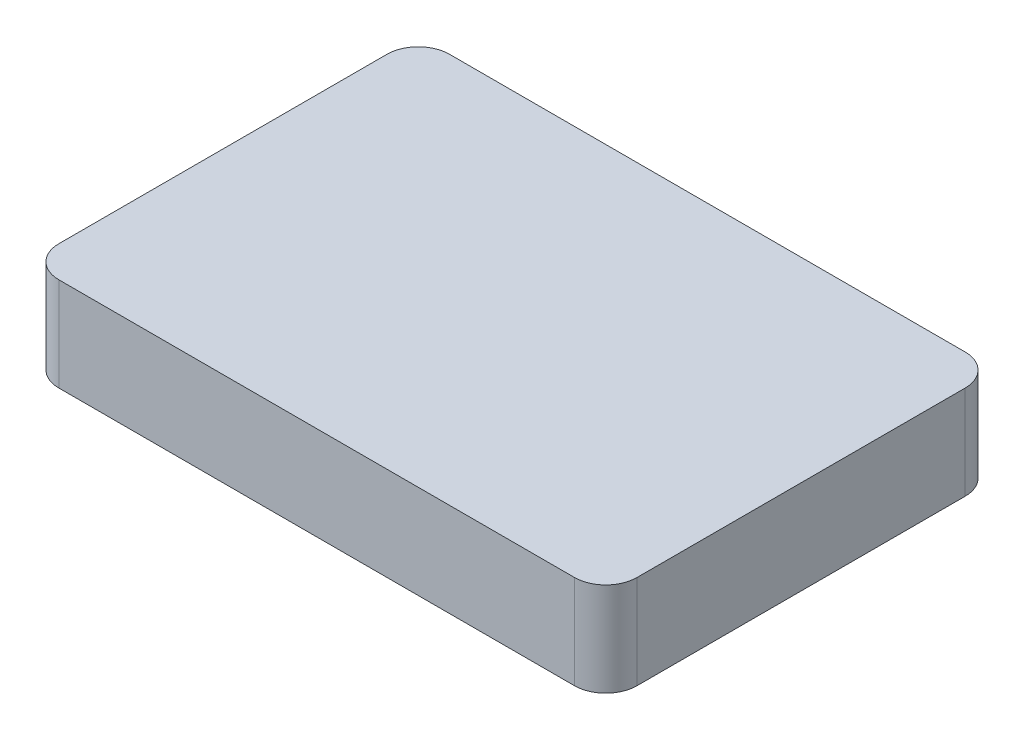
ISO-10303-21;
HEADER;
FILE_DESCRIPTION(('STEP AP214'),'2;1');
FILE_NAME('part.step','',(''),(''),'','','');
FILE_SCHEMA(('AUTOMOTIVE_DESIGN { 1 0 10303 214 1 1 1 1 }'));
ENDSEC;
DATA;
#1=APPLICATION_CONTEXT('core data for automotive mechanical design processes');
#2=APPLICATION_PROTOCOL_DEFINITION('international standard','automotive_design',2000,#1);
#3=PRODUCT_CONTEXT('',#1,'mechanical');
#4=PRODUCT('Part','Part','',(#3));
#5=PRODUCT_RELATED_PRODUCT_CATEGORY('part','',(#4));
#6=PRODUCT_DEFINITION_FORMATION('','',#4);
#7=PRODUCT_DEFINITION_CONTEXT('part definition',#1,'design');
#8=PRODUCT_DEFINITION('design','',#6,#7);
#9=PRODUCT_DEFINITION_SHAPE('','',#8);
#10=(LENGTH_UNIT() NAMED_UNIT(*) SI_UNIT(.MILLI.,.METRE.));
#11=(NAMED_UNIT(*) PLANE_ANGLE_UNIT() SI_UNIT($,.RADIAN.));
#12=(NAMED_UNIT(*) SI_UNIT($,.STERADIAN.) SOLID_ANGLE_UNIT());
#13=UNCERTAINTY_MEASURE_WITH_UNIT(LENGTH_MEASURE(1.E-05),#10,'distance_accuracy_value','');
#14=(GEOMETRIC_REPRESENTATION_CONTEXT(3) GLOBAL_UNCERTAINTY_ASSIGNED_CONTEXT((#13)) GLOBAL_UNIT_ASSIGNED_CONTEXT((#10,
#11,#12)) REPRESENTATION_CONTEXT('',''));
#15=CARTESIAN_POINT('',(0.,0.,0.));
#16=DIRECTION('',(0.,0.,1.));
#17=DIRECTION('',(1.,0.,0.));
#18=AXIS2_PLACEMENT_3D('',#15,#16,#17);
#19=CARTESIAN_POINT('',(-16.5,6.,10.5));
#20=DIRECTION('',(0.,-1.,0.));
#21=DIRECTION('',(0.,0.,-1.));
#22=AXIS2_PLACEMENT_3D('',#19,#20,#21);
#23=CYLINDRICAL_SURFACE('',#22,2.);
#24=CARTESIAN_POINT('',(-16.5,0.,10.5));
#25=DIRECTION('',(0.,1.,0.));
#26=DIRECTION('',(0.,0.,-1.));
#27=AXIS2_PLACEMENT_3D('',#24,#25,#26);
#28=CIRCLE('',#27,2.);
#29=CARTESIAN_POINT('',(-18.5,0.,10.5));
#30=VERTEX_POINT('',#29);
#31=CARTESIAN_POINT('',(-16.5,0.,12.5));
#32=VERTEX_POINT('',#31);
#33=EDGE_CURVE('E129',#30,#32,#28,.T.);
#34=ORIENTED_EDGE('',*,*,#33,.T.);
#35=DIRECTION('',(0.,-1.,0.));
#36=VECTOR('',#35,1.);
#37=CARTESIAN_POINT('',(-16.5,6.,12.5));
#38=LINE('',#37,#36);
#39=CARTESIAN_POINT('',(-16.5,6.,12.5));
#40=VERTEX_POINT('',#39);
#41=EDGE_CURVE('E11',#40,#32,#38,.T.);
#42=ORIENTED_EDGE('',*,*,#41,.F.);
#43=CARTESIAN_POINT('',(-16.5,6.,10.5));
#44=DIRECTION('',(0.,1.,0.));
#45=DIRECTION('',(0.,0.,-1.));
#46=AXIS2_PLACEMENT_3D('',#43,#44,#45);
#47=CIRCLE('',#46,2.);
#48=CARTESIAN_POINT('',(-18.5,6.,10.5));
#49=VERTEX_POINT('',#48);
#50=EDGE_CURVE('E143',#49,#40,#47,.T.);
#51=ORIENTED_EDGE('',*,*,#50,.F.);
#52=DIRECTION('',(0.,-1.,0.));
#53=VECTOR('',#52,1.);
#54=CARTESIAN_POINT('',(-18.5,6.,10.5));
#55=LINE('',#54,#53);
#56=EDGE_CURVE('E125',#49,#30,#55,.T.);
#57=ORIENTED_EDGE('',*,*,#56,.T.);
#58=EDGE_LOOP('',(#34,#42,#51,#57));
#59=FACE_BOUND('',#58,.T.);
#60=ADVANCED_FACE('F33',(#59),#23,.T.);
#61=CARTESIAN_POINT('',(16.5,6.,12.5));
#62=DIRECTION('',(0.,0.,-1.));
#63=DIRECTION('',(-1.,0.,0.));
#64=AXIS2_PLACEMENT_3D('',#61,#62,#63);
#65=PLANE('',#64);
#66=DIRECTION('',(1.,0.,0.));
#67=VECTOR('',#66,1.);
#68=CARTESIAN_POINT('',(16.5,0.,12.5));
#69=LINE('',#68,#67);
#70=CARTESIAN_POINT('',(16.5,0.,12.5));
#71=VERTEX_POINT('',#70);
#72=EDGE_CURVE('E132',#32,#71,#69,.T.);
#73=ORIENTED_EDGE('',*,*,#72,.T.);
#74=DIRECTION('',(0.,-1.,0.));
#75=VECTOR('',#74,1.);
#76=CARTESIAN_POINT('',(16.5,6.,12.5));
#77=LINE('',#76,#75);
#78=CARTESIAN_POINT('',(16.5,6.,12.5));
#79=VERTEX_POINT('',#78);
#80=EDGE_CURVE('E41',#79,#71,#77,.T.);
#81=ORIENTED_EDGE('',*,*,#80,.F.);
#82=DIRECTION('',(1.,0.,0.));
#83=VECTOR('',#82,1.);
#84=CARTESIAN_POINT('',(16.5,6.,12.5));
#85=LINE('',#84,#83);
#86=EDGE_CURVE('E92',#40,#79,#85,.T.);
#87=ORIENTED_EDGE('',*,*,#86,.F.);
#88=ORIENTED_EDGE('',*,*,#41,.T.);
#89=EDGE_LOOP('',(#73,#81,#87,#88));
#90=FACE_BOUND('',#89,.T.);
#91=ADVANCED_FACE('F178',(#90),#65,.F.);
#92=CARTESIAN_POINT('',(16.5,6.,10.5));
#93=DIRECTION('',(0.,-1.,0.));
#94=DIRECTION('',(0.,0.,-1.));
#95=AXIS2_PLACEMENT_3D('',#92,#93,#94);
#96=CYLINDRICAL_SURFACE('',#95,2.);
#97=CARTESIAN_POINT('',(16.5,0.,10.5));
#98=DIRECTION('',(0.,1.,0.));
#99=DIRECTION('',(0.,0.,1.));
#100=AXIS2_PLACEMENT_3D('',#97,#98,#99);
#101=CIRCLE('',#100,2.);
#102=CARTESIAN_POINT('',(18.5,0.,10.5));
#103=VERTEX_POINT('',#102);
#104=EDGE_CURVE('E134',#71,#103,#101,.T.);
#105=ORIENTED_EDGE('',*,*,#104,.T.);
#106=DIRECTION('',(0.,-1.,0.));
#107=VECTOR('',#106,1.);
#108=CARTESIAN_POINT('',(18.5,6.,10.5));
#109=LINE('',#108,#107);
#110=CARTESIAN_POINT('',(18.5,6.,10.5));
#111=VERTEX_POINT('',#110);
#112=EDGE_CURVE('E150',#111,#103,#109,.T.);
#113=ORIENTED_EDGE('',*,*,#112,.F.);
#114=CARTESIAN_POINT('',(16.5,6.,10.5));
#115=DIRECTION('',(0.,1.,0.));
#116=DIRECTION('',(0.,0.,1.));
#117=AXIS2_PLACEMENT_3D('',#114,#115,#116);
#118=CIRCLE('',#117,2.);
#119=EDGE_CURVE('E158',#79,#111,#118,.T.);
#120=ORIENTED_EDGE('',*,*,#119,.F.);
#121=ORIENTED_EDGE('',*,*,#80,.T.);
#122=EDGE_LOOP('',(#105,#113,#120,#121));
#123=FACE_BOUND('',#122,.T.);
#124=ADVANCED_FACE('F156',(#123),#96,.T.);
#125=CARTESIAN_POINT('',(18.5,6.,10.5));
#126=DIRECTION('',(-1.,0.,0.));
#127=DIRECTION('',(0.,0.,1.));
#128=AXIS2_PLACEMENT_3D('',#125,#126,#127);
#129=PLANE('',#128);
#130=DIRECTION('',(0.,0.,-1.));
#131=VECTOR('',#130,1.);
#132=CARTESIAN_POINT('',(18.5,0.,10.5));
#133=LINE('',#132,#131);
#134=CARTESIAN_POINT('',(18.5,0.,-10.5));
#135=VERTEX_POINT('',#134);
#136=EDGE_CURVE('E136',#103,#135,#133,.T.);
#137=ORIENTED_EDGE('',*,*,#136,.T.);
#138=DIRECTION('',(0.,-1.,0.));
#139=VECTOR('',#138,1.);
#140=CARTESIAN_POINT('',(18.5,6.,-10.5));
#141=LINE('',#140,#139);
#142=CARTESIAN_POINT('',(18.5,6.,-10.5));
#143=VERTEX_POINT('',#142);
#144=EDGE_CURVE('E147',#143,#135,#141,.T.);
#145=ORIENTED_EDGE('',*,*,#144,.F.);
#146=DIRECTION('',(0.,0.,-1.));
#147=VECTOR('',#146,1.);
#148=CARTESIAN_POINT('',(18.5,6.,10.5));
#149=LINE('',#148,#147);
#150=EDGE_CURVE('E170',#111,#143,#149,.T.);
#151=ORIENTED_EDGE('',*,*,#150,.F.);
#152=ORIENTED_EDGE('',*,*,#112,.T.);
#153=EDGE_LOOP('',(#137,#145,#151,#152));
#154=FACE_BOUND('',#153,.T.);
#155=ADVANCED_FACE('F166',(#154),#129,.F.);
#156=CARTESIAN_POINT('',(16.5,6.,-10.5));
#157=DIRECTION('',(0.,-1.,0.));
#158=DIRECTION('',(0.,0.,-1.));
#159=AXIS2_PLACEMENT_3D('',#156,#157,#158);
#160=CYLINDRICAL_SURFACE('',#159,2.);
#161=CARTESIAN_POINT('',(16.5,0.,-10.5));
#162=DIRECTION('',(0.,1.,0.));
#163=DIRECTION('',(0.,0.,1.));
#164=AXIS2_PLACEMENT_3D('',#161,#162,#163);
#165=CIRCLE('',#164,2.);
#166=CARTESIAN_POINT('',(16.5,0.,-12.5));
#167=VERTEX_POINT('',#166);
#168=EDGE_CURVE('E138',#135,#167,#165,.T.);
#169=ORIENTED_EDGE('',*,*,#168,.T.);
#170=DIRECTION('',(0.,-1.,0.));
#171=VECTOR('',#170,1.);
#172=CARTESIAN_POINT('',(16.5,6.,-12.5));
#173=LINE('',#172,#171);
#174=CARTESIAN_POINT('',(16.5,6.,-12.5));
#175=VERTEX_POINT('',#174);
#176=EDGE_CURVE('E120',#175,#167,#173,.T.);
#177=ORIENTED_EDGE('',*,*,#176,.F.);
#178=CARTESIAN_POINT('',(16.5,6.,-10.5));
#179=DIRECTION('',(0.,1.,0.));
#180=DIRECTION('',(0.,0.,1.));
#181=AXIS2_PLACEMENT_3D('',#178,#179,#180);
#182=CIRCLE('',#181,2.);
#183=EDGE_CURVE('E111',#143,#175,#182,.T.);
#184=ORIENTED_EDGE('',*,*,#183,.F.);
#185=ORIENTED_EDGE('',*,*,#144,.T.);
#186=EDGE_LOOP('',(#169,#177,#184,#185));
#187=FACE_BOUND('',#186,.T.);
#188=ADVANCED_FACE('F169',(#187),#160,.T.);
#189=CARTESIAN_POINT('',(16.5,6.,-12.5));
#190=DIRECTION('',(0.,0.,1.));
#191=DIRECTION('',(1.,0.,0.));
#192=AXIS2_PLACEMENT_3D('',#189,#190,#191);
#193=PLANE('',#192);
#194=DIRECTION('',(-1.,0.,0.));
#195=VECTOR('',#194,1.);
#196=CARTESIAN_POINT('',(16.5,0.,-12.5));
#197=LINE('',#196,#195);
#198=CARTESIAN_POINT('',(-16.5,0.,-12.5));
#199=VERTEX_POINT('',#198);
#200=EDGE_CURVE('E119',#167,#199,#197,.T.);
#201=ORIENTED_EDGE('',*,*,#200,.T.);
#202=DIRECTION('',(0.,-1.,0.));
#203=VECTOR('',#202,1.);
#204=CARTESIAN_POINT('',(-16.5,6.,-12.5));
#205=LINE('',#204,#203);
#206=CARTESIAN_POINT('',(-16.5,6.,-12.5));
#207=VERTEX_POINT('',#206);
#208=EDGE_CURVE('E116',#207,#199,#205,.T.);
#209=ORIENTED_EDGE('',*,*,#208,.F.);
#210=DIRECTION('',(-1.,0.,0.));
#211=VECTOR('',#210,1.);
#212=CARTESIAN_POINT('',(16.5,6.,-12.5));
#213=LINE('',#212,#211);
#214=EDGE_CURVE('E105',#175,#207,#213,.T.);
#215=ORIENTED_EDGE('',*,*,#214,.F.);
#216=ORIENTED_EDGE('',*,*,#176,.T.);
#217=EDGE_LOOP('',(#201,#209,#215,#216));
#218=FACE_BOUND('',#217,.T.);
#219=ADVANCED_FACE('F117',(#218),#193,.F.);
#220=CARTESIAN_POINT('',(-16.5,6.,-10.5));
#221=DIRECTION('',(0.,-1.,0.));
#222=DIRECTION('',(0.,0.,-1.));
#223=AXIS2_PLACEMENT_3D('',#220,#221,#222);
#224=CYLINDRICAL_SURFACE('',#223,2.);
#225=CARTESIAN_POINT('',(-16.5,0.,-10.5));
#226=DIRECTION('',(0.,1.,0.));
#227=DIRECTION('',(0.,0.,1.));
#228=AXIS2_PLACEMENT_3D('',#225,#226,#227);
#229=CIRCLE('',#228,2.);
#230=CARTESIAN_POINT('',(-18.5,0.,-10.5));
#231=VERTEX_POINT('',#230);
#232=EDGE_CURVE('E78',#199,#231,#229,.T.);
#233=ORIENTED_EDGE('',*,*,#232,.T.);
#234=DIRECTION('',(0.,-1.,0.));
#235=VECTOR('',#234,1.);
#236=CARTESIAN_POINT('',(-18.5,6.,-10.5));
#237=LINE('',#236,#235);
#238=CARTESIAN_POINT('',(-18.5,6.,-10.5));
#239=VERTEX_POINT('',#238);
#240=EDGE_CURVE('E121',#239,#231,#237,.T.);
#241=ORIENTED_EDGE('',*,*,#240,.F.);
#242=CARTESIAN_POINT('',(-16.5,6.,-10.5));
#243=DIRECTION('',(0.,1.,0.));
#244=DIRECTION('',(0.,0.,1.));
#245=AXIS2_PLACEMENT_3D('',#242,#243,#244);
#246=CIRCLE('',#245,2.);
#247=EDGE_CURVE('E109',#207,#239,#246,.T.);
#248=ORIENTED_EDGE('',*,*,#247,.F.);
#249=ORIENTED_EDGE('',*,*,#208,.T.);
#250=EDGE_LOOP('',(#233,#241,#248,#249));
#251=FACE_BOUND('',#250,.T.);
#252=ADVANCED_FACE('F123',(#251),#224,.T.);
#253=CARTESIAN_POINT('',(-18.5,6.,10.5));
#254=DIRECTION('',(1.,0.,0.));
#255=DIRECTION('',(0.,0.,-1.));
#256=AXIS2_PLACEMENT_3D('',#253,#254,#255);
#257=PLANE('',#256);
#258=DIRECTION('',(0.,0.,1.));
#259=VECTOR('',#258,1.);
#260=CARTESIAN_POINT('',(-18.5,0.,10.5));
#261=LINE('',#260,#259);
#262=EDGE_CURVE('E84',#231,#30,#261,.T.);
#263=ORIENTED_EDGE('',*,*,#262,.T.);
#264=ORIENTED_EDGE('',*,*,#56,.F.);
#265=DIRECTION('',(0.,0.,1.));
#266=VECTOR('',#265,1.);
#267=CARTESIAN_POINT('',(-18.5,6.,10.5));
#268=LINE('',#267,#266);
#269=EDGE_CURVE('E49',#239,#49,#268,.T.);
#270=ORIENTED_EDGE('',*,*,#269,.F.);
#271=ORIENTED_EDGE('',*,*,#240,.T.);
#272=EDGE_LOOP('',(#263,#264,#270,#271));
#273=FACE_BOUND('',#272,.T.);
#274=ADVANCED_FACE('F194',(#273),#257,.F.);
#275=CARTESIAN_POINT('',(-16.5,6.,10.5));
#276=DIRECTION('',(0.,-1.,0.));
#277=DIRECTION('',(0.,0.,-1.));
#278=AXIS2_PLACEMENT_3D('',#275,#276,#277);
#279=PLANE('',#278);
#280=ORIENTED_EDGE('',*,*,#50,.T.);
#281=ORIENTED_EDGE('',*,*,#86,.T.);
#282=ORIENTED_EDGE('',*,*,#119,.T.);
#283=ORIENTED_EDGE('',*,*,#150,.T.);
#284=ORIENTED_EDGE('',*,*,#183,.T.);
#285=ORIENTED_EDGE('',*,*,#214,.T.);
#286=ORIENTED_EDGE('',*,*,#247,.T.);
#287=ORIENTED_EDGE('',*,*,#269,.T.);
#288=EDGE_LOOP('',(#280,#281,#282,#283,#284,#285,#286,#287));
#289=FACE_BOUND('',#288,.T.);
#290=ADVANCED_FACE('F107',(#289),#279,.F.);
#291=CARTESIAN_POINT('',(-16.5,0.,10.5));
#292=DIRECTION('',(0.,-1.,0.));
#293=DIRECTION('',(0.,0.,-1.));
#294=AXIS2_PLACEMENT_3D('',#291,#292,#293);
#295=PLANE('',#294);
#296=ORIENTED_EDGE('',*,*,#33,.F.);
#297=ORIENTED_EDGE('',*,*,#262,.F.);
#298=ORIENTED_EDGE('',*,*,#232,.F.);
#299=ORIENTED_EDGE('',*,*,#200,.F.);
#300=ORIENTED_EDGE('',*,*,#168,.F.);
#301=ORIENTED_EDGE('',*,*,#136,.F.);
#302=ORIENTED_EDGE('',*,*,#104,.F.);
#303=ORIENTED_EDGE('',*,*,#72,.F.);
#304=EDGE_LOOP('',(#296,#297,#298,#299,#300,#301,#302,#303));
#305=FACE_BOUND('',#304,.T.);
#306=ADVANCED_FACE('F162',(#305),#295,.T.);
#307=CLOSED_SHELL('',(#60,#91,#124,#155,#188,#219,#252,#274,#290,#306));
#308=MANIFOLD_SOLID_BREP('B2',#307);
#309=ADVANCED_BREP_SHAPE_REPRESENTATION('',(#18,#308),#14);
#310=SHAPE_DEFINITION_REPRESENTATION(#9,#309);
ENDSEC;
END-ISO-10303-21;
